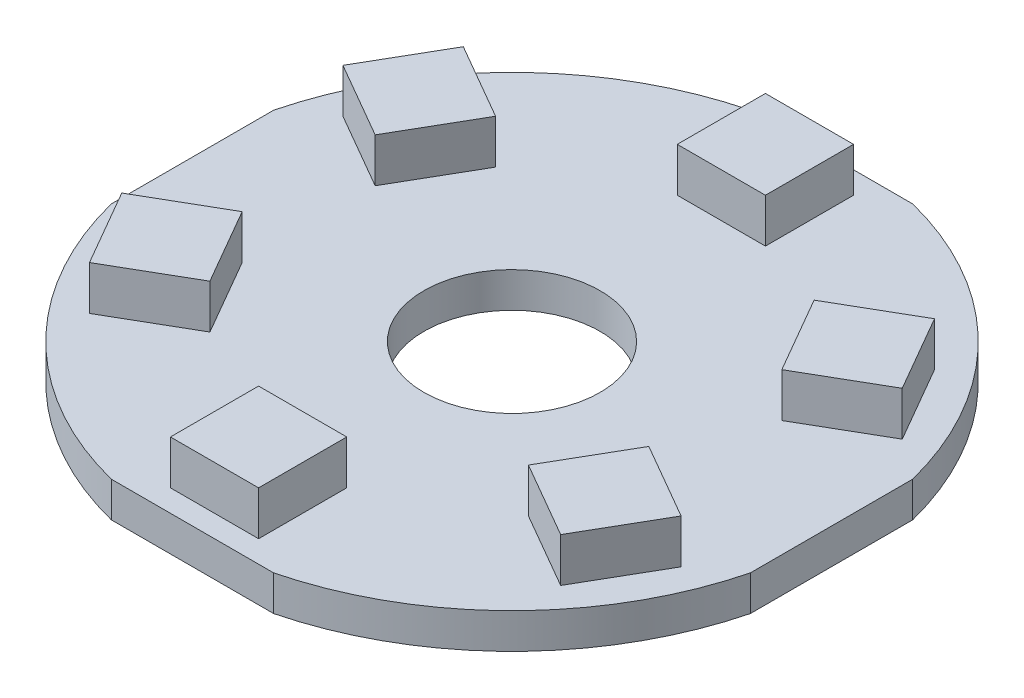
ISO-10303-21;
HEADER;
FILE_DESCRIPTION(('STEP AP214'),'2;1');
FILE_NAME('part.step','',(''),(''),'','','');
FILE_SCHEMA(('AUTOMOTIVE_DESIGN { 1 0 10303 214 1 1 1 1 }'));
ENDSEC;
DATA;
#1=APPLICATION_CONTEXT('core data for automotive mechanical design processes');
#2=APPLICATION_PROTOCOL_DEFINITION('international standard','automotive_design',2000,#1);
#3=PRODUCT_CONTEXT('',#1,'mechanical');
#4=PRODUCT('Part','Part','',(#3));
#5=PRODUCT_RELATED_PRODUCT_CATEGORY('part','',(#4));
#6=PRODUCT_DEFINITION_FORMATION('','',#4);
#7=PRODUCT_DEFINITION_CONTEXT('part definition',#1,'design');
#8=PRODUCT_DEFINITION('design','',#6,#7);
#9=PRODUCT_DEFINITION_SHAPE('','',#8);
#10=(LENGTH_UNIT() NAMED_UNIT(*) SI_UNIT(.MILLI.,.METRE.));
#11=(NAMED_UNIT(*) PLANE_ANGLE_UNIT() SI_UNIT($,.RADIAN.));
#12=(NAMED_UNIT(*) SI_UNIT($,.STERADIAN.) SOLID_ANGLE_UNIT());
#13=UNCERTAINTY_MEASURE_WITH_UNIT(LENGTH_MEASURE(1.E-05),#10,'distance_accuracy_value','');
#14=(GEOMETRIC_REPRESENTATION_CONTEXT(3) GLOBAL_UNCERTAINTY_ASSIGNED_CONTEXT((#13)) GLOBAL_UNIT_ASSIGNED_CONTEXT((#10,
#11,#12)) REPRESENTATION_CONTEXT('',''));
#15=CARTESIAN_POINT('',(0.,0.,0.));
#16=DIRECTION('',(0.,0.,1.));
#17=DIRECTION('',(1.,0.,0.));
#18=AXIS2_PLACEMENT_3D('',#15,#16,#17);
#19=CARTESIAN_POINT('',(0.,2.032,0.));
#20=DIRECTION('',(0.,1.,0.));
#21=DIRECTION('',(0.,0.,1.));
#22=AXIS2_PLACEMENT_3D('',#19,#20,#21);
#23=PLANE('',#22);
#24=DIRECTION('',(0.,0.,-1.));
#25=VECTOR('',#24,1.);
#26=CARTESIAN_POINT('',(2.54,2.032,-17.145));
#27=LINE('',#26,#25);
#28=CARTESIAN_POINT('',(2.54,2.032,-12.065));
#29=VERTEX_POINT('',#28);
#30=CARTESIAN_POINT('',(2.54,2.032,-17.145));
#31=VERTEX_POINT('',#30);
#32=EDGE_CURVE('E458',#29,#31,#27,.T.);
#33=ORIENTED_EDGE('',*,*,#32,.F.);
#34=DIRECTION('',(1.,0.,0.));
#35=VECTOR('',#34,1.);
#36=CARTESIAN_POINT('',(-2.54,2.032,-12.065));
#37=LINE('',#36,#35);
#38=CARTESIAN_POINT('',(-2.54,2.032,-12.065));
#39=VERTEX_POINT('',#38);
#40=EDGE_CURVE('E467',#39,#29,#37,.T.);
#41=ORIENTED_EDGE('',*,*,#40,.F.);
#42=DIRECTION('',(0.,0.,1.));
#43=VECTOR('',#42,1.);
#44=CARTESIAN_POINT('',(-2.54,2.032,-17.145));
#45=LINE('',#44,#43);
#46=CARTESIAN_POINT('',(-2.54,2.032,-17.145));
#47=VERTEX_POINT('',#46);
#48=EDGE_CURVE('E483',#47,#39,#45,.T.);
#49=ORIENTED_EDGE('',*,*,#48,.F.);
#50=DIRECTION('',(-1.,0.,0.));
#51=VECTOR('',#50,1.);
#52=CARTESIAN_POINT('',(-2.54,2.032,-17.145));
#53=LINE('',#52,#51);
#54=EDGE_CURVE('E479',#31,#47,#53,.T.);
#55=ORIENTED_EDGE('',*,*,#54,.F.);
#56=EDGE_LOOP('',(#33,#41,#49,#55));
#57=FACE_BOUND('',#56,.T.);
#58=DIRECTION('',(0.,0.,1.));
#59=VECTOR('',#58,1.);
#60=CARTESIAN_POINT('',(18.415,2.032,-4.67843723907882));
#61=LINE('',#60,#59);
#62=CARTESIAN_POINT('',(18.415,2.032,-4.67843723907882));
#63=VERTEX_POINT('',#62);
#64=CARTESIAN_POINT('',(18.415,2.032,4.67843723907895));
#65=VERTEX_POINT('',#64);
#66=EDGE_CURVE('E512',#63,#65,#61,.T.);
#67=ORIENTED_EDGE('',*,*,#66,.F.);
#68=CARTESIAN_POINT('',(0.,2.032,0.));
#69=DIRECTION('',(0.,1.,0.));
#70=DIRECTION('',(0.,0.,1.));
#71=AXIS2_PLACEMENT_3D('',#68,#69,#70);
#72=CIRCLE('',#71,19.);
#73=CARTESIAN_POINT('',(4.67843723907889,2.032,-18.415));
#74=VERTEX_POINT('',#73);
#75=EDGE_CURVE('E61',#63,#74,#72,.T.);
#76=ORIENTED_EDGE('',*,*,#75,.T.);
#77=DIRECTION('',(1.,0.,0.));
#78=VECTOR('',#77,1.);
#79=CARTESIAN_POINT('',(-4.67843723907889,2.032,-18.415));
#80=LINE('',#79,#78);
#81=CARTESIAN_POINT('',(-4.67843723907889,2.032,-18.415));
#82=VERTEX_POINT('',#81);
#83=EDGE_CURVE('E537',#82,#74,#80,.T.);
#84=ORIENTED_EDGE('',*,*,#83,.F.);
#85=CARTESIAN_POINT('',(-18.415,2.032,-4.67843723907895));
#86=VERTEX_POINT('',#85);
#87=EDGE_CURVE('E64',#82,#86,#72,.T.);
#88=ORIENTED_EDGE('',*,*,#87,.T.);
#89=DIRECTION('',(0.,0.,-1.));
#90=VECTOR('',#89,1.);
#91=CARTESIAN_POINT('',(-18.415,2.032,-4.67843723907895));
#92=LINE('',#91,#90);
#93=CARTESIAN_POINT('',(-18.415,2.032,4.67843723907882));
#94=VERTEX_POINT('',#93);
#95=EDGE_CURVE('E505',#94,#86,#92,.T.);
#96=ORIENTED_EDGE('',*,*,#95,.F.);
#97=CARTESIAN_POINT('',(-4.67843723907889,2.032,18.415));
#98=VERTEX_POINT('',#97);
#99=EDGE_CURVE('E62',#94,#98,#72,.T.);
#100=ORIENTED_EDGE('',*,*,#99,.T.);
#101=DIRECTION('',(-1.,0.,0.));
#102=VECTOR('',#101,1.);
#103=CARTESIAN_POINT('',(-4.67843723907889,2.032,18.415));
#104=LINE('',#103,#102);
#105=CARTESIAN_POINT('',(4.67843723907889,2.032,18.415));
#106=VERTEX_POINT('',#105);
#107=EDGE_CURVE('E543',#106,#98,#104,.T.);
#108=ORIENTED_EDGE('',*,*,#107,.F.);
#109=EDGE_CURVE('E11',#106,#65,#72,.T.);
#110=ORIENTED_EDGE('',*,*,#109,.T.);
#111=EDGE_LOOP('',(#67,#76,#84,#88,#96,#100,#108,#110));
#112=FACE_BOUND('',#111,.T.);
#113=CARTESIAN_POINT('',(0.,2.032,0.));
#114=DIRECTION('',(0.,1.,0.));
#115=DIRECTION('',(0.,0.,1.));
#116=AXIS2_PLACEMENT_3D('',#113,#114,#115);
#117=CIRCLE('',#116,5.08);
#118=CARTESIAN_POINT('',(0.,2.032,5.08));
#119=VERTEX_POINT('',#118);
#120=EDGE_CURVE('E564',#119,#119,#117,.T.);
#121=ORIENTED_EDGE('',*,*,#120,.F.);
#122=EDGE_LOOP('',(#121));
#123=FACE_BOUND('',#122,.T.);
#124=DIRECTION('',(-0.499999999999998,0.,-0.86602540378444));
#125=VECTOR('',#124,1.);
#126=CARTESIAN_POINT('',(13.5780055478842,2.032,-10.7722045256124));
#127=LINE('',#126,#125);
#128=CARTESIAN_POINT('',(16.1180055478842,2.032,-6.37279547438749));
#129=VERTEX_POINT('',#128);
#130=CARTESIAN_POINT('',(13.5780055478842,2.032,-10.7722045256124));
#131=VERTEX_POINT('',#130);
#132=EDGE_CURVE('E298',#129,#131,#127,.T.);
#133=ORIENTED_EDGE('',*,*,#132,.F.);
#134=DIRECTION('',(0.86602540378444,0.,-0.499999999999998));
#135=VECTOR('',#134,1.);
#136=CARTESIAN_POINT('',(16.1180055478842,2.032,-6.37279547438749));
#137=LINE('',#136,#135);
#138=CARTESIAN_POINT('',(11.7185964966593,2.032,-3.8327954743875));
#139=VERTEX_POINT('',#138);
#140=EDGE_CURVE('E294',#139,#129,#137,.T.);
#141=ORIENTED_EDGE('',*,*,#140,.F.);
#142=DIRECTION('',(0.499999999999998,0.,0.86602540378444));
#143=VECTOR('',#142,1.);
#144=CARTESIAN_POINT('',(9.17859649665927,2.032,-8.23220452561245));
#145=LINE('',#144,#143);
#146=CARTESIAN_POINT('',(9.17859649665927,2.032,-8.23220452561245));
#147=VERTEX_POINT('',#146);
#148=EDGE_CURVE('E427',#147,#139,#145,.T.);
#149=ORIENTED_EDGE('',*,*,#148,.F.);
#150=DIRECTION('',(-0.86602540378444,0.,0.499999999999998));
#151=VECTOR('',#150,1.);
#152=CARTESIAN_POINT('',(13.5780055478842,2.032,-10.7722045256124));
#153=LINE('',#152,#151);
#154=EDGE_CURVE('E442',#131,#147,#153,.T.);
#155=ORIENTED_EDGE('',*,*,#154,.F.);
#156=EDGE_LOOP('',(#133,#141,#149,#155));
#157=FACE_BOUND('',#156,.T.);
#158=DIRECTION('',(0.500000000000004,0.,-0.866025403784436));
#159=VECTOR('',#158,1.);
#160=CARTESIAN_POINT('',(16.1180055478842,2.032,6.3727954743876));
#161=LINE('',#160,#159);
#162=CARTESIAN_POINT('',(13.5780055478842,2.032,10.7722045256125));
#163=VERTEX_POINT('',#162);
#164=CARTESIAN_POINT('',(16.1180055478842,2.032,6.3727954743876));
#165=VERTEX_POINT('',#164);
#166=EDGE_CURVE('E1091',#163,#165,#161,.T.);
#167=ORIENTED_EDGE('',*,*,#166,.F.);
#168=DIRECTION('',(0.866025403784437,0.,0.500000000000004));
#169=VECTOR('',#168,1.);
#170=CARTESIAN_POINT('',(13.5780055478842,2.032,10.7722045256125));
#171=LINE('',#170,#169);
#172=CARTESIAN_POINT('',(9.17859649665921,2.032,8.23220452561251));
#173=VERTEX_POINT('',#172);
#174=EDGE_CURVE('E292',#173,#163,#171,.T.);
#175=ORIENTED_EDGE('',*,*,#174,.F.);
#176=DIRECTION('',(-0.500000000000004,0.,0.866025403784436));
#177=VECTOR('',#176,1.);
#178=CARTESIAN_POINT('',(11.7185964966592,2.032,3.83279547438758));
#179=LINE('',#178,#177);
#180=CARTESIAN_POINT('',(11.7185964966592,2.032,3.83279547438758));
#181=VERTEX_POINT('',#180);
#182=EDGE_CURVE('E290',#181,#173,#179,.T.);
#183=ORIENTED_EDGE('',*,*,#182,.F.);
#184=DIRECTION('',(-0.866025403784436,0.,-0.500000000000004));
#185=VECTOR('',#184,1.);
#186=CARTESIAN_POINT('',(16.1180055478842,2.032,6.3727954743876));
#187=LINE('',#186,#185);
#188=EDGE_CURVE('E1090',#165,#181,#187,.T.);
#189=ORIENTED_EDGE('',*,*,#188,.F.);
#190=EDGE_LOOP('',(#167,#175,#183,#189));
#191=FACE_BOUND('',#190,.T.);
#192=DIRECTION('',(1.,0.,0.));
#193=VECTOR('',#192,1.);
#194=CARTESIAN_POINT('',(2.54,2.032,17.145));
#195=LINE('',#194,#193);
#196=CARTESIAN_POINT('',(-2.54,2.032,17.145));
#197=VERTEX_POINT('',#196);
#198=CARTESIAN_POINT('',(2.54,2.032,17.145));
#199=VERTEX_POINT('',#198);
#200=EDGE_CURVE('E322',#197,#199,#195,.T.);
#201=ORIENTED_EDGE('',*,*,#200,.F.);
#202=DIRECTION('',(0.,0.,1.));
#203=VECTOR('',#202,1.);
#204=CARTESIAN_POINT('',(-2.54,2.032,17.145));
#205=LINE('',#204,#203);
#206=CARTESIAN_POINT('',(-2.54,2.032,12.065));
#207=VERTEX_POINT('',#206);
#208=EDGE_CURVE('E319',#207,#197,#205,.T.);
#209=ORIENTED_EDGE('',*,*,#208,.F.);
#210=DIRECTION('',(-1.,0.,0.));
#211=VECTOR('',#210,1.);
#212=CARTESIAN_POINT('',(2.54,2.032,12.065));
#213=LINE('',#212,#211);
#214=CARTESIAN_POINT('',(2.54,2.032,12.065));
#215=VERTEX_POINT('',#214);
#216=EDGE_CURVE('E309',#215,#207,#213,.T.);
#217=ORIENTED_EDGE('',*,*,#216,.F.);
#218=DIRECTION('',(0.,0.,-1.));
#219=VECTOR('',#218,1.);
#220=CARTESIAN_POINT('',(2.54,2.032,17.145));
#221=LINE('',#220,#219);
#222=EDGE_CURVE('E327',#199,#215,#221,.T.);
#223=ORIENTED_EDGE('',*,*,#222,.F.);
#224=EDGE_LOOP('',(#201,#209,#217,#223));
#225=FACE_BOUND('',#224,.T.);
#226=DIRECTION('',(0.499999999999992,0.,0.866025403784443));
#227=VECTOR('',#226,1.);
#228=CARTESIAN_POINT('',(-13.5780055478843,2.032,10.7722045256123));
#229=LINE('',#228,#227);
#230=CARTESIAN_POINT('',(-16.1180055478843,2.032,6.37279547438738));
#231=VERTEX_POINT('',#230);
#232=CARTESIAN_POINT('',(-13.5780055478843,2.032,10.7722045256123));
#233=VERTEX_POINT('',#232);
#234=EDGE_CURVE('E368',#231,#233,#229,.T.);
#235=ORIENTED_EDGE('',*,*,#234,.F.);
#236=DIRECTION('',(-0.866025403784443,0.,0.499999999999992));
#237=VECTOR('',#236,1.);
#238=CARTESIAN_POINT('',(-16.1180055478843,2.032,6.37279547438738));
#239=LINE('',#238,#237);
#240=CARTESIAN_POINT('',(-11.7185964966593,2.032,3.83279547438742));
#241=VERTEX_POINT('',#240);
#242=EDGE_CURVE('E362',#241,#231,#239,.T.);
#243=ORIENTED_EDGE('',*,*,#242,.F.);
#244=DIRECTION('',(-0.499999999999992,0.,-0.866025403784443));
#245=VECTOR('',#244,1.);
#246=CARTESIAN_POINT('',(-9.17859649665932,2.032,8.23220452561239));
#247=LINE('',#246,#245);
#248=CARTESIAN_POINT('',(-9.17859649665932,2.032,8.23220452561239));
#249=VERTEX_POINT('',#248);
#250=EDGE_CURVE('E352',#249,#241,#247,.T.);
#251=ORIENTED_EDGE('',*,*,#250,.F.);
#252=DIRECTION('',(0.866025403784443,0.,-0.499999999999992));
#253=VECTOR('',#252,1.);
#254=CARTESIAN_POINT('',(-13.5780055478843,2.032,10.7722045256123));
#255=LINE('',#254,#253);
#256=EDGE_CURVE('E367',#233,#249,#255,.T.);
#257=ORIENTED_EDGE('',*,*,#256,.F.);
#258=EDGE_LOOP('',(#235,#243,#251,#257));
#259=FACE_BOUND('',#258,.T.);
#260=DIRECTION('',(-0.50000000000001,0.,0.866025403784433));
#261=VECTOR('',#260,1.);
#262=CARTESIAN_POINT('',(-16.1180055478841,2.032,-6.37279547438771));
#263=LINE('',#262,#261);
#264=CARTESIAN_POINT('',(-13.5780055478841,2.032,-10.7722045256126));
#265=VERTEX_POINT('',#264);
#266=CARTESIAN_POINT('',(-16.1180055478841,2.032,-6.37279547438771));
#267=VERTEX_POINT('',#266);
#268=EDGE_CURVE('E403',#265,#267,#263,.T.);
#269=ORIENTED_EDGE('',*,*,#268,.F.);
#270=DIRECTION('',(-0.866025403784433,0.,-0.50000000000001));
#271=VECTOR('',#270,1.);
#272=CARTESIAN_POINT('',(-13.5780055478841,2.032,-10.7722045256126));
#273=LINE('',#272,#271);
#274=CARTESIAN_POINT('',(-9.17859649665915,2.032,-8.23220452561258));
#275=VERTEX_POINT('',#274);
#276=EDGE_CURVE('E402',#275,#265,#273,.T.);
#277=ORIENTED_EDGE('',*,*,#276,.F.);
#278=DIRECTION('',(0.50000000000001,0.,-0.866025403784433));
#279=VECTOR('',#278,1.);
#280=CARTESIAN_POINT('',(-11.7185964966592,2.032,-3.83279547438766));
#281=LINE('',#280,#279);
#282=CARTESIAN_POINT('',(-11.7185964966592,2.032,-3.83279547438766));
#283=VERTEX_POINT('',#282);
#284=EDGE_CURVE('E391',#283,#275,#281,.T.);
#285=ORIENTED_EDGE('',*,*,#284,.F.);
#286=DIRECTION('',(0.866025403784433,0.,0.50000000000001));
#287=VECTOR('',#286,1.);
#288=CARTESIAN_POINT('',(-16.1180055478841,2.032,-6.37279547438771));
#289=LINE('',#288,#287);
#290=EDGE_CURVE('E409',#267,#283,#289,.T.);
#291=ORIENTED_EDGE('',*,*,#290,.F.);
#292=EDGE_LOOP('',(#269,#277,#285,#291));
#293=FACE_BOUND('',#292,.T.);
#294=ADVANCED_FACE('F51',(#57,#112,#123,#157,#191,#225,#259,#293),#23,.T.);
#295=CARTESIAN_POINT('',(0.,2.032,0.));
#296=DIRECTION('',(0.,-1.,0.));
#297=DIRECTION('',(0.,0.,-1.));
#298=AXIS2_PLACEMENT_3D('',#295,#296,#297);
#299=CYLINDRICAL_SURFACE('',#298,19.);
#300=DIRECTION('',(0.,1.,0.));
#301=VECTOR('',#300,1.);
#302=CARTESIAN_POINT('',(-18.415,0.,4.67843723907882));
#303=LINE('',#302,#301);
#304=CARTESIAN_POINT('',(-18.415,0.,4.67843723907882));
#305=VERTEX_POINT('',#304);
#306=EDGE_CURVE('E528',#305,#94,#303,.T.);
#307=ORIENTED_EDGE('',*,*,#306,.F.);
#308=CARTESIAN_POINT('',(0.,0.,0.));
#309=DIRECTION('',(0.,1.,0.));
#310=DIRECTION('',(0.,0.,1.));
#311=AXIS2_PLACEMENT_3D('',#308,#309,#310);
#312=CIRCLE('',#311,19.);
#313=CARTESIAN_POINT('',(-4.67843723907889,0.,18.415));
#314=VERTEX_POINT('',#313);
#315=EDGE_CURVE('E566',#305,#314,#312,.T.);
#316=ORIENTED_EDGE('',*,*,#315,.T.);
#317=DIRECTION('',(0.,1.,0.));
#318=VECTOR('',#317,1.);
#319=CARTESIAN_POINT('',(-4.67843723907889,0.,18.415));
#320=LINE('',#319,#318);
#321=EDGE_CURVE('E518',#314,#98,#320,.T.);
#322=ORIENTED_EDGE('',*,*,#321,.T.);
#323=ORIENTED_EDGE('',*,*,#99,.F.);
#324=EDGE_LOOP('',(#307,#316,#322,#323));
#325=FACE_BOUND('',#324,.T.);
#326=ADVANCED_FACE('F586',(#325),#299,.T.);
#327=DIRECTION('',(0.,1.,0.));
#328=VECTOR('',#327,1.);
#329=CARTESIAN_POINT('',(18.415,0.,-4.67843723907882));
#330=LINE('',#329,#328);
#331=CARTESIAN_POINT('',(18.415,0.,-4.67843723907882));
#332=VERTEX_POINT('',#331);
#333=EDGE_CURVE('E506',#332,#63,#330,.T.);
#334=ORIENTED_EDGE('',*,*,#333,.F.);
#335=CARTESIAN_POINT('',(4.67843723907889,0.,-18.415));
#336=VERTEX_POINT('',#335);
#337=EDGE_CURVE('E607',#332,#336,#312,.T.);
#338=ORIENTED_EDGE('',*,*,#337,.T.);
#339=DIRECTION('',(0.,1.,0.));
#340=VECTOR('',#339,1.);
#341=CARTESIAN_POINT('',(4.67843723907889,0.,-18.415));
#342=LINE('',#341,#340);
#343=EDGE_CURVE('E542',#336,#74,#342,.T.);
#344=ORIENTED_EDGE('',*,*,#343,.T.);
#345=ORIENTED_EDGE('',*,*,#75,.F.);
#346=EDGE_LOOP('',(#334,#338,#344,#345));
#347=FACE_BOUND('',#346,.T.);
#348=ADVANCED_FACE('F596',(#347),#299,.T.);
#349=CARTESIAN_POINT('',(-4.67843723907889,0.,-18.415));
#350=VERTEX_POINT('',#349);
#351=CARTESIAN_POINT('',(-18.415,0.,-4.67843723907895));
#352=VERTEX_POINT('',#351);
#353=EDGE_CURVE('E613',#350,#352,#312,.T.);
#354=ORIENTED_EDGE('',*,*,#353,.T.);
#355=DIRECTION('',(0.,1.,0.));
#356=VECTOR('',#355,1.);
#357=CARTESIAN_POINT('',(-18.415,0.,-4.67843723907895));
#358=LINE('',#357,#356);
#359=EDGE_CURVE('E514',#352,#86,#358,.T.);
#360=ORIENTED_EDGE('',*,*,#359,.T.);
#361=ORIENTED_EDGE('',*,*,#87,.F.);
#362=DIRECTION('',(0.,1.,0.));
#363=VECTOR('',#362,1.);
#364=CARTESIAN_POINT('',(-4.67843723907889,0.,-18.415));
#365=LINE('',#364,#363);
#366=EDGE_CURVE('E538',#350,#82,#365,.T.);
#367=ORIENTED_EDGE('',*,*,#366,.F.);
#368=EDGE_LOOP('',(#354,#360,#361,#367));
#369=FACE_BOUND('',#368,.T.);
#370=ADVANCED_FACE('F589',(#369),#299,.T.);
#371=CARTESIAN_POINT('',(0.,0.,0.));
#372=DIRECTION('',(0.,1.,0.));
#373=DIRECTION('',(0.,0.,1.));
#374=AXIS2_PLACEMENT_3D('',#371,#372,#373);
#375=PLANE('',#374);
#376=ORIENTED_EDGE('',*,*,#337,.F.);
#377=DIRECTION('',(0.,0.,1.));
#378=VECTOR('',#377,1.);
#379=CARTESIAN_POINT('',(18.415,0.,-4.67843723907882));
#380=LINE('',#379,#378);
#381=CARTESIAN_POINT('',(18.415,0.,4.67843723907895));
#382=VERTEX_POINT('',#381);
#383=EDGE_CURVE('E507',#332,#382,#380,.T.);
#384=ORIENTED_EDGE('',*,*,#383,.T.);
#385=CARTESIAN_POINT('',(4.67843723907889,0.,18.415));
#386=VERTEX_POINT('',#385);
#387=EDGE_CURVE('E54',#386,#382,#312,.T.);
#388=ORIENTED_EDGE('',*,*,#387,.F.);
#389=DIRECTION('',(-1.,0.,0.));
#390=VECTOR('',#389,1.);
#391=CARTESIAN_POINT('',(-4.67843723907889,0.,18.415));
#392=LINE('',#391,#390);
#393=EDGE_CURVE('E551',#386,#314,#392,.T.);
#394=ORIENTED_EDGE('',*,*,#393,.T.);
#395=ORIENTED_EDGE('',*,*,#315,.F.);
#396=DIRECTION('',(0.,0.,-1.));
#397=VECTOR('',#396,1.);
#398=CARTESIAN_POINT('',(-18.415,0.,-4.67843723907895));
#399=LINE('',#398,#397);
#400=EDGE_CURVE('E525',#305,#352,#399,.T.);
#401=ORIENTED_EDGE('',*,*,#400,.T.);
#402=ORIENTED_EDGE('',*,*,#353,.F.);
#403=DIRECTION('',(1.,0.,0.));
#404=VECTOR('',#403,1.);
#405=CARTESIAN_POINT('',(-4.67843723907889,0.,-18.415));
#406=LINE('',#405,#404);
#407=EDGE_CURVE('E534',#350,#336,#406,.T.);
#408=ORIENTED_EDGE('',*,*,#407,.T.);
#409=EDGE_LOOP('',(#376,#384,#388,#394,#395,#401,#402,#408));
#410=FACE_BOUND('',#409,.T.);
#411=CARTESIAN_POINT('',(0.,0.,0.));
#412=DIRECTION('',(0.,1.,0.));
#413=DIRECTION('',(0.,0.,1.));
#414=AXIS2_PLACEMENT_3D('',#411,#412,#413);
#415=CIRCLE('',#414,5.08);
#416=CARTESIAN_POINT('',(0.,0.,5.08));
#417=VERTEX_POINT('',#416);
#418=EDGE_CURVE('E547',#417,#417,#415,.T.);
#419=ORIENTED_EDGE('',*,*,#418,.T.);
#420=EDGE_LOOP('',(#419));
#421=FACE_BOUND('',#420,.T.);
#422=ADVANCED_FACE('F574',(#410,#421),#375,.F.);
#423=ORIENTED_EDGE('',*,*,#387,.T.);
#424=DIRECTION('',(0.,1.,0.));
#425=VECTOR('',#424,1.);
#426=CARTESIAN_POINT('',(18.415,0.,4.67843723907895));
#427=LINE('',#426,#425);
#428=EDGE_CURVE('E513',#382,#65,#427,.T.);
#429=ORIENTED_EDGE('',*,*,#428,.T.);
#430=ORIENTED_EDGE('',*,*,#109,.F.);
#431=DIRECTION('',(0.,1.,0.));
#432=VECTOR('',#431,1.);
#433=CARTESIAN_POINT('',(4.67843723907889,0.,18.415));
#434=LINE('',#433,#432);
#435=EDGE_CURVE('E552',#386,#106,#434,.T.);
#436=ORIENTED_EDGE('',*,*,#435,.F.);
#437=EDGE_LOOP('',(#423,#429,#430,#436));
#438=FACE_BOUND('',#437,.T.);
#439=ADVANCED_FACE('F52',(#438),#299,.T.);
#440=CARTESIAN_POINT('',(0.,2.032,0.));
#441=DIRECTION('',(0.,-1.,0.));
#442=DIRECTION('',(0.,0.,-1.));
#443=AXIS2_PLACEMENT_3D('',#440,#441,#442);
#444=CYLINDRICAL_SURFACE('',#443,5.08);
#445=ORIENTED_EDGE('',*,*,#120,.T.);
#446=EDGE_LOOP('',(#445));
#447=FACE_BOUND('',#446,.T.);
#448=ORIENTED_EDGE('',*,*,#418,.F.);
#449=EDGE_LOOP('',(#448));
#450=FACE_BOUND('',#449,.T.);
#451=ADVANCED_FACE('F575',(#447,#450),#444,.F.);
#452=CARTESIAN_POINT('',(-4.67843723907889,0.,18.415));
#453=DIRECTION('',(0.,0.,-1.));
#454=DIRECTION('',(-1.,0.,0.));
#455=AXIS2_PLACEMENT_3D('',#452,#453,#454);
#456=PLANE('',#455);
#457=ORIENTED_EDGE('',*,*,#107,.T.);
#458=ORIENTED_EDGE('',*,*,#321,.F.);
#459=ORIENTED_EDGE('',*,*,#393,.F.);
#460=ORIENTED_EDGE('',*,*,#435,.T.);
#461=EDGE_LOOP('',(#457,#458,#459,#460));
#462=FACE_BOUND('',#461,.T.);
#463=ADVANCED_FACE('F580',(#462),#456,.F.);
#464=CARTESIAN_POINT('',(-4.67843723907889,0.,-18.415));
#465=DIRECTION('',(0.,0.,1.));
#466=DIRECTION('',(1.,0.,0.));
#467=AXIS2_PLACEMENT_3D('',#464,#465,#466);
#468=PLANE('',#467);
#469=ORIENTED_EDGE('',*,*,#83,.T.);
#470=ORIENTED_EDGE('',*,*,#343,.F.);
#471=ORIENTED_EDGE('',*,*,#407,.F.);
#472=ORIENTED_EDGE('',*,*,#366,.T.);
#473=EDGE_LOOP('',(#469,#470,#471,#472));
#474=FACE_BOUND('',#473,.T.);
#475=ADVANCED_FACE('F585',(#474),#468,.F.);
#476=CARTESIAN_POINT('',(18.415,0.,-4.67843723907882));
#477=DIRECTION('',(-1.,0.,0.));
#478=DIRECTION('',(0.,0.,1.));
#479=AXIS2_PLACEMENT_3D('',#476,#477,#478);
#480=PLANE('',#479);
#481=ORIENTED_EDGE('',*,*,#66,.T.);
#482=ORIENTED_EDGE('',*,*,#428,.F.);
#483=ORIENTED_EDGE('',*,*,#383,.F.);
#484=ORIENTED_EDGE('',*,*,#333,.T.);
#485=EDGE_LOOP('',(#481,#482,#483,#484));
#486=FACE_BOUND('',#485,.T.);
#487=ADVANCED_FACE('F676',(#486),#480,.F.);
#488=CARTESIAN_POINT('',(-18.415,0.,-4.67843723907895));
#489=DIRECTION('',(1.,0.,0.));
#490=DIRECTION('',(0.,0.,-1.));
#491=AXIS2_PLACEMENT_3D('',#488,#489,#490);
#492=PLANE('',#491);
#493=ORIENTED_EDGE('',*,*,#95,.T.);
#494=ORIENTED_EDGE('',*,*,#359,.F.);
#495=ORIENTED_EDGE('',*,*,#400,.F.);
#496=ORIENTED_EDGE('',*,*,#306,.T.);
#497=EDGE_LOOP('',(#493,#494,#495,#496));
#498=FACE_BOUND('',#497,.T.);
#499=ADVANCED_FACE('F690',(#498),#492,.F.);
#500=CARTESIAN_POINT('',(2.54,4.572,-17.145));
#501=DIRECTION('',(-1.,0.,0.));
#502=DIRECTION('',(0.,0.,1.));
#503=AXIS2_PLACEMENT_3D('',#500,#501,#502);
#504=PLANE('',#503);
#505=ORIENTED_EDGE('',*,*,#32,.T.);
#506=DIRECTION('',(0.,-1.,0.));
#507=VECTOR('',#506,1.);
#508=CARTESIAN_POINT('',(2.54,4.572,-17.145));
#509=LINE('',#508,#507);
#510=CARTESIAN_POINT('',(2.54,4.572,-17.145));
#511=VERTEX_POINT('',#510);
#512=EDGE_CURVE('E501',#511,#31,#509,.T.);
#513=ORIENTED_EDGE('',*,*,#512,.F.);
#514=DIRECTION('',(0.,0.,-1.));
#515=VECTOR('',#514,1.);
#516=CARTESIAN_POINT('',(2.54,4.572,-17.145));
#517=LINE('',#516,#515);
#518=CARTESIAN_POINT('',(2.54,4.572,-12.065));
#519=VERTEX_POINT('',#518);
#520=EDGE_CURVE('E461',#519,#511,#517,.T.);
#521=ORIENTED_EDGE('',*,*,#520,.F.);
#522=DIRECTION('',(0.,-1.,0.));
#523=VECTOR('',#522,1.);
#524=CARTESIAN_POINT('',(2.54,4.572,-12.065));
#525=LINE('',#524,#523);
#526=EDGE_CURVE('E474',#519,#29,#525,.T.);
#527=ORIENTED_EDGE('',*,*,#526,.T.);
#528=EDGE_LOOP('',(#505,#513,#521,#527));
#529=FACE_BOUND('',#528,.T.);
#530=ADVANCED_FACE('F694',(#529),#504,.F.);
#531=CARTESIAN_POINT('',(-2.54,4.572,-17.145));
#532=DIRECTION('',(0.,0.,1.));
#533=DIRECTION('',(1.,0.,0.));
#534=AXIS2_PLACEMENT_3D('',#531,#532,#533);
#535=PLANE('',#534);
#536=ORIENTED_EDGE('',*,*,#54,.T.);
#537=DIRECTION('',(0.,-1.,0.));
#538=VECTOR('',#537,1.);
#539=CARTESIAN_POINT('',(-2.54,4.572,-17.145));
#540=LINE('',#539,#538);
#541=CARTESIAN_POINT('',(-2.54,4.572,-17.145));
#542=VERTEX_POINT('',#541);
#543=EDGE_CURVE('E500',#542,#47,#540,.T.);
#544=ORIENTED_EDGE('',*,*,#543,.F.);
#545=DIRECTION('',(-1.,0.,0.));
#546=VECTOR('',#545,1.);
#547=CARTESIAN_POINT('',(-2.54,4.572,-17.145));
#548=LINE('',#547,#546);
#549=EDGE_CURVE('E465',#511,#542,#548,.T.);
#550=ORIENTED_EDGE('',*,*,#549,.F.);
#551=ORIENTED_EDGE('',*,*,#512,.T.);
#552=EDGE_LOOP('',(#536,#544,#550,#551));
#553=FACE_BOUND('',#552,.T.);
#554=ADVANCED_FACE('F761',(#553),#535,.F.);
#555=CARTESIAN_POINT('',(-2.54,4.572,-17.145));
#556=DIRECTION('',(1.,0.,0.));
#557=DIRECTION('',(0.,0.,-1.));
#558=AXIS2_PLACEMENT_3D('',#555,#556,#557);
#559=PLANE('',#558);
#560=ORIENTED_EDGE('',*,*,#48,.T.);
#561=DIRECTION('',(0.,-1.,0.));
#562=VECTOR('',#561,1.);
#563=CARTESIAN_POINT('',(-2.54,4.572,-12.065));
#564=LINE('',#563,#562);
#565=CARTESIAN_POINT('',(-2.54,4.572,-12.065));
#566=VERTEX_POINT('',#565);
#567=EDGE_CURVE('E492',#566,#39,#564,.T.);
#568=ORIENTED_EDGE('',*,*,#567,.F.);
#569=DIRECTION('',(0.,0.,1.));
#570=VECTOR('',#569,1.);
#571=CARTESIAN_POINT('',(-2.54,4.572,-17.145));
#572=LINE('',#571,#570);
#573=EDGE_CURVE('E469',#542,#566,#572,.T.);
#574=ORIENTED_EDGE('',*,*,#573,.F.);
#575=ORIENTED_EDGE('',*,*,#543,.T.);
#576=EDGE_LOOP('',(#560,#568,#574,#575));
#577=FACE_BOUND('',#576,.T.);
#578=ADVANCED_FACE('F772',(#577),#559,.F.);
#579=CARTESIAN_POINT('',(-2.54,4.572,-12.065));
#580=DIRECTION('',(0.,0.,-1.));
#581=DIRECTION('',(-1.,0.,0.));
#582=AXIS2_PLACEMENT_3D('',#579,#580,#581);
#583=PLANE('',#582);
#584=ORIENTED_EDGE('',*,*,#40,.T.);
#585=ORIENTED_EDGE('',*,*,#526,.F.);
#586=DIRECTION('',(1.,0.,0.));
#587=VECTOR('',#586,1.);
#588=CARTESIAN_POINT('',(-2.54,4.572,-12.065));
#589=LINE('',#588,#587);
#590=EDGE_CURVE('E472',#566,#519,#589,.T.);
#591=ORIENTED_EDGE('',*,*,#590,.F.);
#592=ORIENTED_EDGE('',*,*,#567,.T.);
#593=EDGE_LOOP('',(#584,#585,#591,#592));
#594=FACE_BOUND('',#593,.T.);
#595=ADVANCED_FACE('F782',(#594),#583,.F.);
#596=CARTESIAN_POINT('',(0.,4.572,0.));
#597=DIRECTION('',(0.,1.,0.));
#598=DIRECTION('',(0.,0.,1.));
#599=AXIS2_PLACEMENT_3D('',#596,#597,#598);
#600=PLANE('',#599);
#601=ORIENTED_EDGE('',*,*,#520,.T.);
#602=ORIENTED_EDGE('',*,*,#549,.T.);
#603=ORIENTED_EDGE('',*,*,#573,.T.);
#604=ORIENTED_EDGE('',*,*,#590,.T.);
#605=EDGE_LOOP('',(#601,#602,#603,#604));
#606=FACE_BOUND('',#605,.T.);
#607=ADVANCED_FACE('F791',(#606),#600,.T.);
#608=CARTESIAN_POINT('',(16.1180055478842,4.572,-6.37279547438749));
#609=DIRECTION('',(-0.499999999999998,0.,-0.86602540378444));
#610=DIRECTION('',(-0.86602540378444,0.,0.499999999999998));
#611=AXIS2_PLACEMENT_3D('',#608,#609,#610);
#612=PLANE('',#611);
#613=ORIENTED_EDGE('',*,*,#140,.T.);
#614=DIRECTION('',(0.,-1.,0.));
#615=VECTOR('',#614,1.);
#616=CARTESIAN_POINT('',(16.1180055478842,4.572,-6.37279547438749));
#617=LINE('',#616,#615);
#618=CARTESIAN_POINT('',(16.1180055478842,4.572,-6.37279547438749));
#619=VERTEX_POINT('',#618);
#620=EDGE_CURVE('E460',#619,#129,#617,.T.);
#621=ORIENTED_EDGE('',*,*,#620,.F.);
#622=DIRECTION('',(0.86602540378444,0.,-0.499999999999998));
#623=VECTOR('',#622,1.);
#624=CARTESIAN_POINT('',(16.1180055478842,4.572,-6.37279547438749));
#625=LINE('',#624,#623);
#626=CARTESIAN_POINT('',(11.7185964966593,4.572,-3.8327954743875));
#627=VERTEX_POINT('',#626);
#628=EDGE_CURVE('E424',#627,#619,#625,.T.);
#629=ORIENTED_EDGE('',*,*,#628,.F.);
#630=DIRECTION('',(0.,-1.,0.));
#631=VECTOR('',#630,1.);
#632=CARTESIAN_POINT('',(11.7185964966593,4.572,-3.8327954743875));
#633=LINE('',#632,#631);
#634=EDGE_CURVE('E440',#627,#139,#633,.T.);
#635=ORIENTED_EDGE('',*,*,#634,.T.);
#636=EDGE_LOOP('',(#613,#621,#629,#635));
#637=FACE_BOUND('',#636,.T.);
#638=ADVANCED_FACE('F796',(#637),#612,.F.);
#639=CARTESIAN_POINT('',(13.5780055478842,4.572,-10.7722045256124));
#640=DIRECTION('',(-0.86602540378444,0.,0.499999999999998));
#641=DIRECTION('',(0.499999999999998,0.,0.86602540378444));
#642=AXIS2_PLACEMENT_3D('',#639,#640,#641);
#643=PLANE('',#642);
#644=ORIENTED_EDGE('',*,*,#132,.T.);
#645=DIRECTION('',(0.,-1.,0.));
#646=VECTOR('',#645,1.);
#647=CARTESIAN_POINT('',(13.5780055478842,4.572,-10.7722045256124));
#648=LINE('',#647,#646);
#649=CARTESIAN_POINT('',(13.5780055478842,4.572,-10.7722045256124));
#650=VERTEX_POINT('',#649);
#651=EDGE_CURVE('E453',#650,#131,#648,.T.);
#652=ORIENTED_EDGE('',*,*,#651,.F.);
#653=DIRECTION('',(-0.499999999999998,0.,-0.86602540378444));
#654=VECTOR('',#653,1.);
#655=CARTESIAN_POINT('',(13.5780055478842,4.572,-10.7722045256124));
#656=LINE('',#655,#654);
#657=EDGE_CURVE('E428',#619,#650,#656,.T.);
#658=ORIENTED_EDGE('',*,*,#657,.F.);
#659=ORIENTED_EDGE('',*,*,#620,.T.);
#660=EDGE_LOOP('',(#644,#652,#658,#659));
#661=FACE_BOUND('',#660,.T.);
#662=ADVANCED_FACE('F813',(#661),#643,.F.);
#663=CARTESIAN_POINT('',(13.5780055478842,4.572,-10.7722045256124));
#664=DIRECTION('',(0.499999999999998,0.,0.86602540378444));
#665=DIRECTION('',(0.86602540378444,0.,-0.499999999999998));
#666=AXIS2_PLACEMENT_3D('',#663,#664,#665);
#667=PLANE('',#666);
#668=ORIENTED_EDGE('',*,*,#154,.T.);
#669=DIRECTION('',(0.,-1.,0.));
#670=VECTOR('',#669,1.);
#671=CARTESIAN_POINT('',(9.17859649665927,4.572,-8.23220452561245));
#672=LINE('',#671,#670);
#673=CARTESIAN_POINT('',(9.17859649665927,4.572,-8.23220452561245));
#674=VERTEX_POINT('',#673);
#675=EDGE_CURVE('E450',#674,#147,#672,.T.);
#676=ORIENTED_EDGE('',*,*,#675,.F.);
#677=DIRECTION('',(-0.86602540378444,0.,0.499999999999998));
#678=VECTOR('',#677,1.);
#679=CARTESIAN_POINT('',(13.5780055478842,4.572,-10.7722045256124));
#680=LINE('',#679,#678);
#681=EDGE_CURVE('E435',#650,#674,#680,.T.);
#682=ORIENTED_EDGE('',*,*,#681,.F.);
#683=ORIENTED_EDGE('',*,*,#651,.T.);
#684=EDGE_LOOP('',(#668,#676,#682,#683));
#685=FACE_BOUND('',#684,.T.);
#686=ADVANCED_FACE('F822',(#685),#667,.F.);
#687=CARTESIAN_POINT('',(9.17859649665927,4.572,-8.23220452561245));
#688=DIRECTION('',(0.86602540378444,0.,-0.499999999999998));
#689=DIRECTION('',(-0.499999999999998,0.,-0.86602540378444));
#690=AXIS2_PLACEMENT_3D('',#687,#688,#689);
#691=PLANE('',#690);
#692=ORIENTED_EDGE('',*,*,#148,.T.);
#693=ORIENTED_EDGE('',*,*,#634,.F.);
#694=DIRECTION('',(0.499999999999998,0.,0.86602540378444));
#695=VECTOR('',#694,1.);
#696=CARTESIAN_POINT('',(9.17859649665927,4.572,-8.23220452561245));
#697=LINE('',#696,#695);
#698=EDGE_CURVE('E434',#674,#627,#697,.T.);
#699=ORIENTED_EDGE('',*,*,#698,.F.);
#700=ORIENTED_EDGE('',*,*,#675,.T.);
#701=EDGE_LOOP('',(#692,#693,#699,#700));
#702=FACE_BOUND('',#701,.T.);
#703=ADVANCED_FACE('F834',(#702),#691,.F.);
#704=CARTESIAN_POINT('',(0.,4.572,0.));
#705=DIRECTION('',(0.,1.,0.));
#706=DIRECTION('',(-0.86602540378444,0.,0.499999999999998));
#707=AXIS2_PLACEMENT_3D('',#704,#705,#706);
#708=PLANE('',#707);
#709=ORIENTED_EDGE('',*,*,#628,.T.);
#710=ORIENTED_EDGE('',*,*,#657,.T.);
#711=ORIENTED_EDGE('',*,*,#681,.T.);
#712=ORIENTED_EDGE('',*,*,#698,.T.);
#713=EDGE_LOOP('',(#709,#710,#711,#712));
#714=FACE_BOUND('',#713,.T.);
#715=ADVANCED_FACE('F841',(#714),#708,.T.);
#716=CARTESIAN_POINT('',(13.5780055478842,4.572,10.7722045256125));
#717=DIRECTION('',(0.500000000000004,0.,-0.866025403784436));
#718=DIRECTION('',(-0.866025403784436,0.,-0.500000000000004));
#719=AXIS2_PLACEMENT_3D('',#716,#717,#718);
#720=PLANE('',#719);
#721=ORIENTED_EDGE('',*,*,#174,.T.);
#722=DIRECTION('',(0.,-1.,0.));
#723=VECTOR('',#722,1.);
#724=CARTESIAN_POINT('',(13.5780055478842,4.572,10.7722045256125));
#725=LINE('',#724,#723);
#726=CARTESIAN_POINT('',(13.5780055478842,4.572,10.7722045256125));
#727=VERTEX_POINT('',#726);
#728=EDGE_CURVE('E267',#727,#163,#725,.T.);
#729=ORIENTED_EDGE('',*,*,#728,.F.);
#730=DIRECTION('',(0.866025403784437,0.,0.500000000000004));
#731=VECTOR('',#730,1.);
#732=CARTESIAN_POINT('',(13.5780055478842,4.572,10.7722045256125));
#733=LINE('',#732,#731);
#734=CARTESIAN_POINT('',(9.17859649665921,4.572,8.23220452561251));
#735=VERTEX_POINT('',#734);
#736=EDGE_CURVE('E280',#735,#727,#733,.T.);
#737=ORIENTED_EDGE('',*,*,#736,.F.);
#738=DIRECTION('',(0.,-1.,0.));
#739=VECTOR('',#738,1.);
#740=CARTESIAN_POINT('',(9.17859649665921,4.572,8.23220452561251));
#741=LINE('',#740,#739);
#742=EDGE_CURVE('E1083',#735,#173,#741,.T.);
#743=ORIENTED_EDGE('',*,*,#742,.T.);
#744=EDGE_LOOP('',(#721,#729,#737,#743));
#745=FACE_BOUND('',#744,.T.);
#746=ADVANCED_FACE('F289',(#745),#720,.F.);
#747=CARTESIAN_POINT('',(16.1180055478842,4.572,6.3727954743876));
#748=DIRECTION('',(-0.866025403784436,0.,-0.500000000000004));
#749=DIRECTION('',(-0.500000000000004,0.,0.866025403784436));
#750=AXIS2_PLACEMENT_3D('',#747,#748,#749);
#751=PLANE('',#750);
#752=ORIENTED_EDGE('',*,*,#166,.T.);
#753=DIRECTION('',(0.,-1.,0.));
#754=VECTOR('',#753,1.);
#755=CARTESIAN_POINT('',(16.1180055478842,4.572,6.3727954743876));
#756=LINE('',#755,#754);
#757=CARTESIAN_POINT('',(16.1180055478842,4.572,6.3727954743876));
#758=VERTEX_POINT('',#757);
#759=EDGE_CURVE('E275',#758,#165,#756,.T.);
#760=ORIENTED_EDGE('',*,*,#759,.F.);
#761=DIRECTION('',(0.500000000000004,0.,-0.866025403784436));
#762=VECTOR('',#761,1.);
#763=CARTESIAN_POINT('',(16.1180055478842,4.572,6.3727954743876));
#764=LINE('',#763,#762);
#765=EDGE_CURVE('E264',#727,#758,#764,.T.);
#766=ORIENTED_EDGE('',*,*,#765,.F.);
#767=ORIENTED_EDGE('',*,*,#728,.T.);
#768=EDGE_LOOP('',(#752,#760,#766,#767));
#769=FACE_BOUND('',#768,.T.);
#770=ADVANCED_FACE('F270',(#769),#751,.F.);
#771=CARTESIAN_POINT('',(16.1180055478842,4.572,6.3727954743876));
#772=DIRECTION('',(-0.500000000000004,0.,0.866025403784436));
#773=DIRECTION('',(0.866025403784436,0.,0.500000000000004));
#774=AXIS2_PLACEMENT_3D('',#771,#772,#773);
#775=PLANE('',#774);
#776=ORIENTED_EDGE('',*,*,#188,.T.);
#777=DIRECTION('',(0.,-1.,0.));
#778=VECTOR('',#777,1.);
#779=CARTESIAN_POINT('',(11.7185964966592,4.572,3.83279547438758));
#780=LINE('',#779,#778);
#781=CARTESIAN_POINT('',(11.7185964966592,4.572,3.83279547438758));
#782=VERTEX_POINT('',#781);
#783=EDGE_CURVE('E302',#782,#181,#780,.T.);
#784=ORIENTED_EDGE('',*,*,#783,.F.);
#785=DIRECTION('',(-0.866025403784436,0.,-0.500000000000004));
#786=VECTOR('',#785,1.);
#787=CARTESIAN_POINT('',(16.1180055478842,4.572,6.3727954743876));
#788=LINE('',#787,#786);
#789=EDGE_CURVE('E277',#758,#782,#788,.T.);
#790=ORIENTED_EDGE('',*,*,#789,.F.);
#791=ORIENTED_EDGE('',*,*,#759,.T.);
#792=EDGE_LOOP('',(#776,#784,#790,#791));
#793=FACE_BOUND('',#792,.T.);
#794=ADVANCED_FACE('F869',(#793),#775,.F.);
#795=CARTESIAN_POINT('',(11.7185964966592,4.572,3.83279547438758));
#796=DIRECTION('',(0.866025403784436,0.,0.500000000000004));
#797=DIRECTION('',(0.500000000000004,0.,-0.866025403784436));
#798=AXIS2_PLACEMENT_3D('',#795,#796,#797);
#799=PLANE('',#798);
#800=ORIENTED_EDGE('',*,*,#182,.T.);
#801=ORIENTED_EDGE('',*,*,#742,.F.);
#802=DIRECTION('',(-0.500000000000004,0.,0.866025403784436));
#803=VECTOR('',#802,1.);
#804=CARTESIAN_POINT('',(11.7185964966592,4.572,3.83279547438758));
#805=LINE('',#804,#803);
#806=EDGE_CURVE('E282',#782,#735,#805,.T.);
#807=ORIENTED_EDGE('',*,*,#806,.F.);
#808=ORIENTED_EDGE('',*,*,#783,.T.);
#809=EDGE_LOOP('',(#800,#801,#807,#808));
#810=FACE_BOUND('',#809,.T.);
#811=ADVANCED_FACE('F878',(#810),#799,.F.);
#812=CARTESIAN_POINT('',(0.,4.572,0.));
#813=DIRECTION('',(0.,1.,0.));
#814=DIRECTION('',(-0.866025403784436,0.,-0.500000000000004));
#815=AXIS2_PLACEMENT_3D('',#812,#813,#814);
#816=PLANE('',#815);
#817=ORIENTED_EDGE('',*,*,#736,.T.);
#818=ORIENTED_EDGE('',*,*,#765,.T.);
#819=ORIENTED_EDGE('',*,*,#789,.T.);
#820=ORIENTED_EDGE('',*,*,#806,.T.);
#821=EDGE_LOOP('',(#817,#818,#819,#820));
#822=FACE_BOUND('',#821,.T.);
#823=ADVANCED_FACE('F278',(#822),#816,.T.);
#824=CARTESIAN_POINT('',(-2.54,4.572,17.145));
#825=DIRECTION('',(1.,0.,0.));
#826=DIRECTION('',(0.,0.,-1.));
#827=AXIS2_PLACEMENT_3D('',#824,#825,#826);
#828=PLANE('',#827);
#829=ORIENTED_EDGE('',*,*,#208,.T.);
#830=DIRECTION('',(0.,-1.,0.));
#831=VECTOR('',#830,1.);
#832=CARTESIAN_POINT('',(-2.54,4.572,17.145));
#833=LINE('',#832,#831);
#834=CARTESIAN_POINT('',(-2.54,4.572,17.145));
#835=VERTEX_POINT('',#834);
#836=EDGE_CURVE('E344',#835,#197,#833,.T.);
#837=ORIENTED_EDGE('',*,*,#836,.F.);
#838=DIRECTION('',(0.,0.,1.));
#839=VECTOR('',#838,1.);
#840=CARTESIAN_POINT('',(-2.54,4.572,17.145));
#841=LINE('',#840,#839);
#842=CARTESIAN_POINT('',(-2.54,4.572,12.065));
#843=VERTEX_POINT('',#842);
#844=EDGE_CURVE('E301',#843,#835,#841,.T.);
#845=ORIENTED_EDGE('',*,*,#844,.F.);
#846=DIRECTION('',(0.,-1.,0.));
#847=VECTOR('',#846,1.);
#848=CARTESIAN_POINT('',(-2.54,4.572,12.065));
#849=LINE('',#848,#847);
#850=EDGE_CURVE('E317',#843,#207,#849,.T.);
#851=ORIENTED_EDGE('',*,*,#850,.T.);
#852=EDGE_LOOP('',(#829,#837,#845,#851));
#853=FACE_BOUND('',#852,.T.);
#854=ADVANCED_FACE('F896',(#853),#828,.F.);
#855=CARTESIAN_POINT('',(2.54,4.572,17.145));
#856=DIRECTION('',(0.,0.,-1.));
#857=DIRECTION('',(-1.,0.,0.));
#858=AXIS2_PLACEMENT_3D('',#855,#856,#857);
#859=PLANE('',#858);
#860=ORIENTED_EDGE('',*,*,#200,.T.);
#861=DIRECTION('',(0.,-1.,0.));
#862=VECTOR('',#861,1.);
#863=CARTESIAN_POINT('',(2.54,4.572,17.145));
#864=LINE('',#863,#862);
#865=CARTESIAN_POINT('',(2.54,4.572,17.145));
#866=VERTEX_POINT('',#865);
#867=EDGE_CURVE('E340',#866,#199,#864,.T.);
#868=ORIENTED_EDGE('',*,*,#867,.F.);
#869=DIRECTION('',(1.,0.,0.));
#870=VECTOR('',#869,1.);
#871=CARTESIAN_POINT('',(2.54,4.572,17.145));
#872=LINE('',#871,#870);
#873=EDGE_CURVE('E310',#835,#866,#872,.T.);
#874=ORIENTED_EDGE('',*,*,#873,.F.);
#875=ORIENTED_EDGE('',*,*,#836,.T.);
#876=EDGE_LOOP('',(#860,#868,#874,#875));
#877=FACE_BOUND('',#876,.T.);
#878=ADVANCED_FACE('F910',(#877),#859,.F.);
#879=CARTESIAN_POINT('',(2.54,4.572,17.145));
#880=DIRECTION('',(-1.,0.,0.));
#881=DIRECTION('',(0.,0.,1.));
#882=AXIS2_PLACEMENT_3D('',#879,#880,#881);
#883=PLANE('',#882);
#884=ORIENTED_EDGE('',*,*,#222,.T.);
#885=DIRECTION('',(0.,-1.,0.));
#886=VECTOR('',#885,1.);
#887=CARTESIAN_POINT('',(2.54,4.572,12.065));
#888=LINE('',#887,#886);
#889=CARTESIAN_POINT('',(2.54,4.572,12.065));
#890=VERTEX_POINT('',#889);
#891=EDGE_CURVE('E337',#890,#215,#888,.T.);
#892=ORIENTED_EDGE('',*,*,#891,.F.);
#893=DIRECTION('',(0.,0.,-1.));
#894=VECTOR('',#893,1.);
#895=CARTESIAN_POINT('',(2.54,4.572,17.145));
#896=LINE('',#895,#894);
#897=EDGE_CURVE('E311',#866,#890,#896,.T.);
#898=ORIENTED_EDGE('',*,*,#897,.F.);
#899=ORIENTED_EDGE('',*,*,#867,.T.);
#900=EDGE_LOOP('',(#884,#892,#898,#899));
#901=FACE_BOUND('',#900,.T.);
#902=ADVANCED_FACE('F920',(#901),#883,.F.);
#903=CARTESIAN_POINT('',(2.54,4.572,12.065));
#904=DIRECTION('',(0.,0.,1.));
#905=DIRECTION('',(1.,0.,0.));
#906=AXIS2_PLACEMENT_3D('',#903,#904,#905);
#907=PLANE('',#906);
#908=ORIENTED_EDGE('',*,*,#216,.T.);
#909=ORIENTED_EDGE('',*,*,#850,.F.);
#910=DIRECTION('',(-1.,0.,0.));
#911=VECTOR('',#910,1.);
#912=CARTESIAN_POINT('',(2.54,4.572,12.065));
#913=LINE('',#912,#911);
#914=EDGE_CURVE('E316',#890,#843,#913,.T.);
#915=ORIENTED_EDGE('',*,*,#914,.F.);
#916=ORIENTED_EDGE('',*,*,#891,.T.);
#917=EDGE_LOOP('',(#908,#909,#915,#916));
#918=FACE_BOUND('',#917,.T.);
#919=ADVANCED_FACE('F930',(#918),#907,.F.);
#920=CARTESIAN_POINT('',(0.,4.572,0.));
#921=DIRECTION('',(0.,1.,0.));
#922=DIRECTION('',(0.,0.,-1.));
#923=AXIS2_PLACEMENT_3D('',#920,#921,#922);
#924=PLANE('',#923);
#925=ORIENTED_EDGE('',*,*,#844,.T.);
#926=ORIENTED_EDGE('',*,*,#873,.T.);
#927=ORIENTED_EDGE('',*,*,#897,.T.);
#928=ORIENTED_EDGE('',*,*,#914,.T.);
#929=EDGE_LOOP('',(#925,#926,#927,#928));
#930=FACE_BOUND('',#929,.T.);
#931=ADVANCED_FACE('F940',(#930),#924,.T.);
#932=CARTESIAN_POINT('',(-16.1180055478843,4.572,6.37279547438738));
#933=DIRECTION('',(0.499999999999992,0.,0.866025403784443));
#934=DIRECTION('',(0.866025403784443,0.,-0.499999999999992));
#935=AXIS2_PLACEMENT_3D('',#932,#933,#934);
#936=PLANE('',#935);
#937=ORIENTED_EDGE('',*,*,#242,.T.);
#938=DIRECTION('',(0.,-1.,0.));
#939=VECTOR('',#938,1.);
#940=CARTESIAN_POINT('',(-16.1180055478843,4.572,6.37279547438738));
#941=LINE('',#940,#939);
#942=CARTESIAN_POINT('',(-16.1180055478843,4.572,6.37279547438738));
#943=VERTEX_POINT('',#942);
#944=EDGE_CURVE('E324',#943,#231,#941,.T.);
#945=ORIENTED_EDGE('',*,*,#944,.F.);
#946=DIRECTION('',(-0.866025403784443,0.,0.499999999999992));
#947=VECTOR('',#946,1.);
#948=CARTESIAN_POINT('',(-16.1180055478843,4.572,6.37279547438738));
#949=LINE('',#948,#947);
#950=CARTESIAN_POINT('',(-11.7185964966593,4.572,3.83279547438742));
#951=VERTEX_POINT('',#950);
#952=EDGE_CURVE('E350',#951,#943,#949,.T.);
#953=ORIENTED_EDGE('',*,*,#952,.F.);
#954=DIRECTION('',(0.,-1.,0.));
#955=VECTOR('',#954,1.);
#956=CARTESIAN_POINT('',(-11.7185964966593,4.572,3.83279547438742));
#957=LINE('',#956,#955);
#958=EDGE_CURVE('E363',#951,#241,#957,.T.);
#959=ORIENTED_EDGE('',*,*,#958,.T.);
#960=EDGE_LOOP('',(#937,#945,#953,#959));
#961=FACE_BOUND('',#960,.T.);
#962=ADVANCED_FACE('F950',(#961),#936,.F.);
#963=CARTESIAN_POINT('',(-13.5780055478843,4.572,10.7722045256123));
#964=DIRECTION('',(0.866025403784443,0.,-0.499999999999992));
#965=DIRECTION('',(-0.499999999999992,0.,-0.866025403784443));
#966=AXIS2_PLACEMENT_3D('',#963,#964,#965);
#967=PLANE('',#966);
#968=ORIENTED_EDGE('',*,*,#234,.T.);
#969=DIRECTION('',(0.,-1.,0.));
#970=VECTOR('',#969,1.);
#971=CARTESIAN_POINT('',(-13.5780055478843,4.572,10.7722045256123));
#972=LINE('',#971,#970);
#973=CARTESIAN_POINT('',(-13.5780055478843,4.572,10.7722045256123));
#974=VERTEX_POINT('',#973);
#975=EDGE_CURVE('E379',#974,#233,#972,.T.);
#976=ORIENTED_EDGE('',*,*,#975,.F.);
#977=DIRECTION('',(0.499999999999992,0.,0.866025403784443));
#978=VECTOR('',#977,1.);
#979=CARTESIAN_POINT('',(-13.5780055478843,4.572,10.7722045256123));
#980=LINE('',#979,#978);
#981=EDGE_CURVE('E351',#943,#974,#980,.T.);
#982=ORIENTED_EDGE('',*,*,#981,.F.);
#983=ORIENTED_EDGE('',*,*,#944,.T.);
#984=EDGE_LOOP('',(#968,#976,#982,#983));
#985=FACE_BOUND('',#984,.T.);
#986=ADVANCED_FACE('F957',(#985),#967,.F.);
#987=CARTESIAN_POINT('',(-13.5780055478843,4.572,10.7722045256123));
#988=DIRECTION('',(-0.499999999999992,0.,-0.866025403784443));
#989=DIRECTION('',(-0.866025403784443,0.,0.499999999999992));
#990=AXIS2_PLACEMENT_3D('',#987,#988,#989);
#991=PLANE('',#990);
#992=ORIENTED_EDGE('',*,*,#256,.T.);
#993=DIRECTION('',(0.,-1.,0.));
#994=VECTOR('',#993,1.);
#995=CARTESIAN_POINT('',(-9.17859649665932,4.572,8.23220452561239));
#996=LINE('',#995,#994);
#997=CARTESIAN_POINT('',(-9.17859649665932,4.572,8.23220452561239));
#998=VERTEX_POINT('',#997);
#999=EDGE_CURVE('E79',#998,#249,#996,.T.);
#1000=ORIENTED_EDGE('',*,*,#999,.F.);
#1001=DIRECTION('',(0.866025403784443,0.,-0.499999999999992));
#1002=VECTOR('',#1001,1.);
#1003=CARTESIAN_POINT('',(-13.5780055478843,4.572,10.7722045256123));
#1004=LINE('',#1003,#1002);
#1005=EDGE_CURVE('E355',#974,#998,#1004,.T.);
#1006=ORIENTED_EDGE('',*,*,#1005,.F.);
#1007=ORIENTED_EDGE('',*,*,#975,.T.);
#1008=EDGE_LOOP('',(#992,#1000,#1006,#1007));
#1009=FACE_BOUND('',#1008,.T.);
#1010=ADVANCED_FACE('F967',(#1009),#991,.F.);
#1011=CARTESIAN_POINT('',(-9.17859649665932,4.572,8.23220452561239));
#1012=DIRECTION('',(-0.866025403784443,0.,0.499999999999992));
#1013=DIRECTION('',(0.499999999999992,0.,0.866025403784443));
#1014=AXIS2_PLACEMENT_3D('',#1011,#1012,#1013);
#1015=PLANE('',#1014);
#1016=ORIENTED_EDGE('',*,*,#250,.T.);
#1017=ORIENTED_EDGE('',*,*,#958,.F.);
#1018=DIRECTION('',(-0.499999999999992,0.,-0.866025403784443));
#1019=VECTOR('',#1018,1.);
#1020=CARTESIAN_POINT('',(-9.17859649665932,4.572,8.23220452561239));
#1021=LINE('',#1020,#1019);
#1022=EDGE_CURVE('E358',#998,#951,#1021,.T.);
#1023=ORIENTED_EDGE('',*,*,#1022,.F.);
#1024=ORIENTED_EDGE('',*,*,#999,.T.);
#1025=EDGE_LOOP('',(#1016,#1017,#1023,#1024));
#1026=FACE_BOUND('',#1025,.T.);
#1027=ADVANCED_FACE('F980',(#1026),#1015,.F.);
#1028=CARTESIAN_POINT('',(0.,4.572,0.));
#1029=DIRECTION('',(0.,1.,0.));
#1030=DIRECTION('',(0.866025403784443,0.,-0.499999999999992));
#1031=AXIS2_PLACEMENT_3D('',#1028,#1029,#1030);
#1032=PLANE('',#1031);
#1033=ORIENTED_EDGE('',*,*,#952,.T.);
#1034=ORIENTED_EDGE('',*,*,#981,.T.);
#1035=ORIENTED_EDGE('',*,*,#1005,.T.);
#1036=ORIENTED_EDGE('',*,*,#1022,.T.);
#1037=EDGE_LOOP('',(#1033,#1034,#1035,#1036));
#1038=FACE_BOUND('',#1037,.T.);
#1039=ADVANCED_FACE('F990',(#1038),#1032,.T.);
#1040=CARTESIAN_POINT('',(-13.5780055478841,4.572,-10.7722045256126));
#1041=DIRECTION('',(-0.50000000000001,0.,0.866025403784433));
#1042=DIRECTION('',(0.866025403784433,0.,0.50000000000001));
#1043=AXIS2_PLACEMENT_3D('',#1040,#1041,#1042);
#1044=PLANE('',#1043);
#1045=ORIENTED_EDGE('',*,*,#276,.T.);
#1046=DIRECTION('',(0.,-1.,0.));
#1047=VECTOR('',#1046,1.);
#1048=CARTESIAN_POINT('',(-13.5780055478841,4.572,-10.7722045256126));
#1049=LINE('',#1048,#1047);
#1050=CARTESIAN_POINT('',(-13.5780055478841,4.572,-10.7722045256126));
#1051=VERTEX_POINT('',#1050);
#1052=EDGE_CURVE('E370',#1051,#265,#1049,.T.);
#1053=ORIENTED_EDGE('',*,*,#1052,.F.);
#1054=DIRECTION('',(-0.866025403784433,0.,-0.50000000000001));
#1055=VECTOR('',#1054,1.);
#1056=CARTESIAN_POINT('',(-13.5780055478841,4.572,-10.7722045256126));
#1057=LINE('',#1056,#1055);
#1058=CARTESIAN_POINT('',(-9.17859649665915,4.572,-8.23220452561258));
#1059=VERTEX_POINT('',#1058);
#1060=EDGE_CURVE('E387',#1059,#1051,#1057,.T.);
#1061=ORIENTED_EDGE('',*,*,#1060,.F.);
#1062=DIRECTION('',(0.,-1.,0.));
#1063=VECTOR('',#1062,1.);
#1064=CARTESIAN_POINT('',(-9.17859649665915,4.572,-8.23220452561258));
#1065=LINE('',#1064,#1063);
#1066=EDGE_CURVE('E396',#1059,#275,#1065,.T.);
#1067=ORIENTED_EDGE('',*,*,#1066,.T.);
#1068=EDGE_LOOP('',(#1045,#1053,#1061,#1067));
#1069=FACE_BOUND('',#1068,.T.);
#1070=ADVANCED_FACE('F996',(#1069),#1044,.F.);
#1071=CARTESIAN_POINT('',(-16.1180055478841,4.572,-6.37279547438771));
#1072=DIRECTION('',(0.866025403784433,0.,0.50000000000001));
#1073=DIRECTION('',(0.50000000000001,0.,-0.866025403784433));
#1074=AXIS2_PLACEMENT_3D('',#1071,#1072,#1073);
#1075=PLANE('',#1074);
#1076=ORIENTED_EDGE('',*,*,#268,.T.);
#1077=DIRECTION('',(0.,-1.,0.));
#1078=VECTOR('',#1077,1.);
#1079=CARTESIAN_POINT('',(-16.1180055478841,4.572,-6.37279547438771));
#1080=LINE('',#1079,#1078);
#1081=CARTESIAN_POINT('',(-16.1180055478841,4.572,-6.37279547438771));
#1082=VERTEX_POINT('',#1081);
#1083=EDGE_CURVE('E416',#1082,#267,#1080,.T.);
#1084=ORIENTED_EDGE('',*,*,#1083,.F.);
#1085=DIRECTION('',(-0.50000000000001,0.,0.866025403784433));
#1086=VECTOR('',#1085,1.);
#1087=CARTESIAN_POINT('',(-16.1180055478841,4.572,-6.37279547438771));
#1088=LINE('',#1087,#1086);
#1089=EDGE_CURVE('E388',#1051,#1082,#1088,.T.);
#1090=ORIENTED_EDGE('',*,*,#1089,.F.);
#1091=ORIENTED_EDGE('',*,*,#1052,.T.);
#1092=EDGE_LOOP('',(#1076,#1084,#1090,#1091));
#1093=FACE_BOUND('',#1092,.T.);
#1094=ADVANCED_FACE('F1007',(#1093),#1075,.F.);
#1095=CARTESIAN_POINT('',(-16.1180055478841,4.572,-6.37279547438771));
#1096=DIRECTION('',(0.50000000000001,0.,-0.866025403784433));
#1097=DIRECTION('',(-0.866025403784433,0.,-0.50000000000001));
#1098=AXIS2_PLACEMENT_3D('',#1095,#1096,#1097);
#1099=PLANE('',#1098);
#1100=ORIENTED_EDGE('',*,*,#290,.T.);
#1101=DIRECTION('',(0.,-1.,0.));
#1102=VECTOR('',#1101,1.);
#1103=CARTESIAN_POINT('',(-11.7185964966592,4.572,-3.83279547438766));
#1104=LINE('',#1103,#1102);
#1105=CARTESIAN_POINT('',(-11.7185964966592,4.572,-3.83279547438766));
#1106=VERTEX_POINT('',#1105);
#1107=EDGE_CURVE('E66',#1106,#283,#1104,.T.);
#1108=ORIENTED_EDGE('',*,*,#1107,.F.);
#1109=DIRECTION('',(0.866025403784433,0.,0.50000000000001));
#1110=VECTOR('',#1109,1.);
#1111=CARTESIAN_POINT('',(-16.1180055478841,4.572,-6.37279547438771));
#1112=LINE('',#1111,#1110);
#1113=EDGE_CURVE('E393',#1082,#1106,#1112,.T.);
#1114=ORIENTED_EDGE('',*,*,#1113,.F.);
#1115=ORIENTED_EDGE('',*,*,#1083,.T.);
#1116=EDGE_LOOP('',(#1100,#1108,#1114,#1115));
#1117=FACE_BOUND('',#1116,.T.);
#1118=ADVANCED_FACE('F1017',(#1117),#1099,.F.);
#1119=CARTESIAN_POINT('',(-11.7185964966592,4.572,-3.83279547438766));
#1120=DIRECTION('',(-0.866025403784433,0.,-0.50000000000001));
#1121=DIRECTION('',(-0.50000000000001,0.,0.866025403784433));
#1122=AXIS2_PLACEMENT_3D('',#1119,#1120,#1121);
#1123=PLANE('',#1122);
#1124=ORIENTED_EDGE('',*,*,#284,.T.);
#1125=ORIENTED_EDGE('',*,*,#1066,.F.);
#1126=DIRECTION('',(0.50000000000001,0.,-0.866025403784433));
#1127=VECTOR('',#1126,1.);
#1128=CARTESIAN_POINT('',(-11.7185964966592,4.572,-3.83279547438766));
#1129=LINE('',#1128,#1127);
#1130=EDGE_CURVE('E400',#1106,#1059,#1129,.T.);
#1131=ORIENTED_EDGE('',*,*,#1130,.F.);
#1132=ORIENTED_EDGE('',*,*,#1107,.T.);
#1133=EDGE_LOOP('',(#1124,#1125,#1131,#1132));
#1134=FACE_BOUND('',#1133,.T.);
#1135=ADVANCED_FACE('F1028',(#1134),#1123,.F.);
#1136=CARTESIAN_POINT('',(0.,4.572,0.));
#1137=DIRECTION('',(0.,1.,0.));
#1138=DIRECTION('',(0.866025403784433,0.,0.50000000000001));
#1139=AXIS2_PLACEMENT_3D('',#1136,#1137,#1138);
#1140=PLANE('',#1139);
#1141=ORIENTED_EDGE('',*,*,#1060,.T.);
#1142=ORIENTED_EDGE('',*,*,#1089,.T.);
#1143=ORIENTED_EDGE('',*,*,#1113,.T.);
#1144=ORIENTED_EDGE('',*,*,#1130,.T.);
#1145=EDGE_LOOP('',(#1141,#1142,#1143,#1144));
#1146=FACE_BOUND('',#1145,.T.);
#1147=ADVANCED_FACE('F1036',(#1146),#1140,.T.);
#1148=CLOSED_SHELL('',(#294,#326,#348,#370,#422,#439,#451,#463,#475,#487,#499,#530,#554,#578,
#595,#607,#638,#662,#686,#703,#715,#746,#770,#794,#811,#823,#854,#878,#902,#919,#931,#962,#986,
#1010,#1027,#1039,#1070,#1094,#1118,#1135,#1147));
#1149=MANIFOLD_SOLID_BREP('B2',#1148);
#1150=ADVANCED_BREP_SHAPE_REPRESENTATION('',(#18,#1149),#14);
#1151=SHAPE_DEFINITION_REPRESENTATION(#9,#1150);
ENDSEC;
END-ISO-10303-21;
